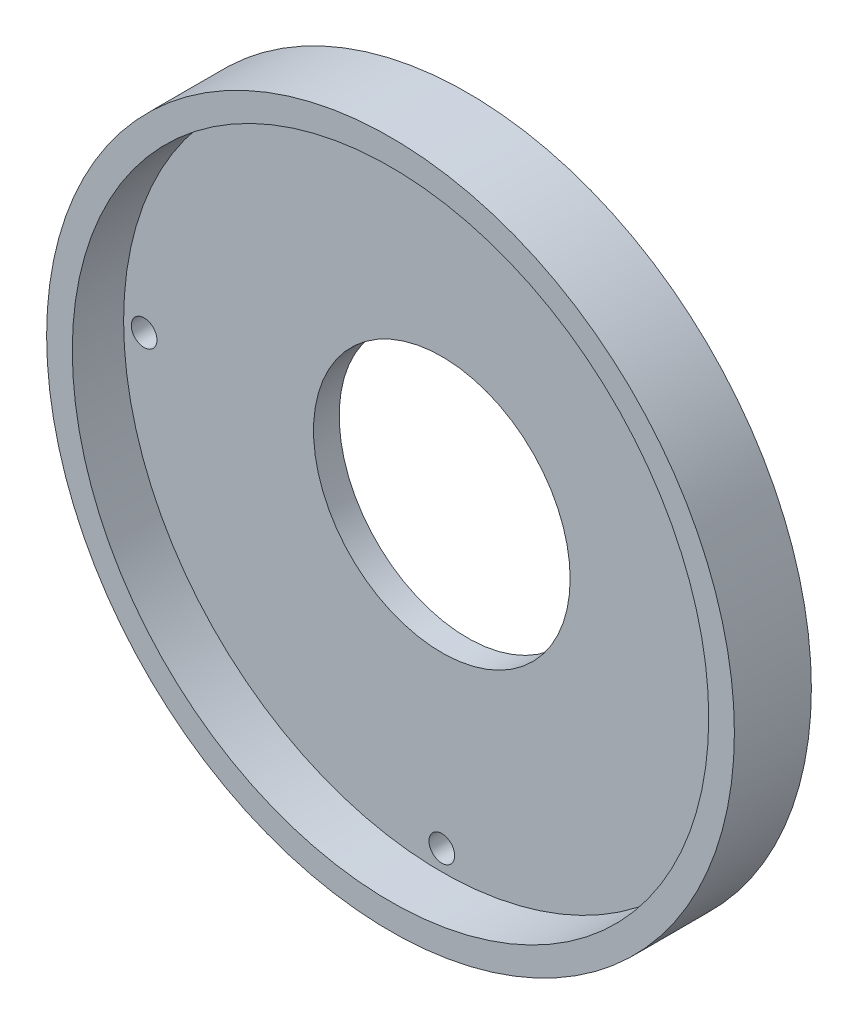
ISO-10303-21;
HEADER;
FILE_DESCRIPTION(('STEP AP214'),'2;1');
FILE_NAME('part.step','',(''),(''),'','','');
FILE_SCHEMA(('AUTOMOTIVE_DESIGN { 1 0 10303 214 1 1 1 1 }'));
ENDSEC;
DATA;
#1=APPLICATION_CONTEXT('core data for automotive mechanical design processes');
#2=APPLICATION_PROTOCOL_DEFINITION('international standard','automotive_design',2000,#1);
#3=PRODUCT_CONTEXT('',#1,'mechanical');
#4=PRODUCT('Part','Part','',(#3));
#5=PRODUCT_RELATED_PRODUCT_CATEGORY('part','',(#4));
#6=PRODUCT_DEFINITION_FORMATION('','',#4);
#7=PRODUCT_DEFINITION_CONTEXT('part definition',#1,'design');
#8=PRODUCT_DEFINITION('design','',#6,#7);
#9=PRODUCT_DEFINITION_SHAPE('','',#8);
#10=(LENGTH_UNIT() NAMED_UNIT(*) SI_UNIT(.MILLI.,.METRE.));
#11=(NAMED_UNIT(*) PLANE_ANGLE_UNIT() SI_UNIT($,.RADIAN.));
#12=(NAMED_UNIT(*) SI_UNIT($,.STERADIAN.) SOLID_ANGLE_UNIT());
#13=UNCERTAINTY_MEASURE_WITH_UNIT(LENGTH_MEASURE(1.E-05),#10,'distance_accuracy_value','');
#14=(GEOMETRIC_REPRESENTATION_CONTEXT(3) GLOBAL_UNCERTAINTY_ASSIGNED_CONTEXT((#13)) GLOBAL_UNIT_ASSIGNED_CONTEXT((#10,
#11,#12)) REPRESENTATION_CONTEXT('',''));
#15=CARTESIAN_POINT('',(0.,0.,0.));
#16=DIRECTION('',(0.,0.,1.));
#17=DIRECTION('',(1.,0.,0.));
#18=AXIS2_PLACEMENT_3D('',#15,#16,#17);
#19=CARTESIAN_POINT('',(0.,0.,5.));
#20=DIRECTION('',(0.,0.,-1.));
#21=DIRECTION('',(-1.,0.,0.));
#22=AXIS2_PLACEMENT_3D('',#19,#20,#21);
#23=CYLINDRICAL_SURFACE('',#22,67.);
#24=CARTESIAN_POINT('',(0.,0.,0.));
#25=DIRECTION('',(0.,0.,1.));
#26=DIRECTION('',(1.,0.,0.));
#27=AXIS2_PLACEMENT_3D('',#24,#25,#26);
#28=CIRCLE('',#27,67.);
#29=CARTESIAN_POINT('',(67.,0.,0.));
#30=VERTEX_POINT('',#29);
#31=EDGE_CURVE('E48',#30,#30,#28,.T.);
#32=ORIENTED_EDGE('',*,*,#31,.T.);
#33=EDGE_LOOP('',(#32));
#34=FACE_BOUND('',#33,.T.);
#35=CARTESIAN_POINT('',(0.,0.,15.));
#36=DIRECTION('',(0.,0.,1.));
#37=DIRECTION('',(1.,0.,0.));
#38=AXIS2_PLACEMENT_3D('',#35,#36,#37);
#39=CIRCLE('',#38,67.);
#40=CARTESIAN_POINT('',(67.,0.,15.));
#41=VERTEX_POINT('',#40);
#42=EDGE_CURVE('E89',#41,#41,#39,.T.);
#43=ORIENTED_EDGE('',*,*,#42,.F.);
#44=EDGE_LOOP('',(#43));
#45=FACE_BOUND('',#44,.T.);
#46=CARTESIAN_POINT('',(48.2517919166919,-46.4840249637256,10.));
#47=CARTESIAN_POINT('',(48.251789828071,-46.4840272751934,10.0702064929586));
#48=CARTESIAN_POINT('',(48.2476744077071,-46.488300234178,10.1404637367399));
#49=CARTESIAN_POINT('',(48.2313079825116,-46.5052799581222,10.2790428534805));
#50=CARTESIAN_POINT('',(48.2190472140223,-46.5179968446309,10.3473623010423));
#51=CARTESIAN_POINT('',(48.1867201860451,-46.551482642508,10.4800381366662));
#52=CARTESIAN_POINT('',(48.1666576896979,-46.5722476718622,10.5443964180764));
#53=CARTESIAN_POINT('',(48.1192723617108,-46.6212052856211,10.6673348688312));
#54=CARTESIAN_POINT('',(48.0919513226366,-46.6493960361591,10.7259164598931));
#55=CARTESIAN_POINT('',(48.0307787559355,-46.712377523685,10.8356723307161));
#56=CARTESIAN_POINT('',(47.996925836134,-46.7471696676369,10.8868450273029));
#57=CARTESIAN_POINT('',(47.9236127295296,-46.8223247270508,10.9803174329759));
#58=CARTESIAN_POINT('',(47.8841523214327,-46.8626878623647,11.0226167917214));
#59=CARTESIAN_POINT('',(47.8007045773974,-46.9478028103199,11.0971415966695));
#60=CARTESIAN_POINT('',(47.7567169959419,-46.9925548609739,11.1293664961326));
#61=CARTESIAN_POINT('',(47.6654330583694,-47.0851432348739,11.1828239081577));
#62=CARTESIAN_POINT('',(47.6181367114616,-47.1329795495353,11.2040564513135));
#63=CARTESIAN_POINT('',(47.5215608296741,-47.2303499369865,11.2349241394158));
#64=CARTESIAN_POINT('',(47.4722815256982,-47.2798838120061,11.2445606306394));
#65=CARTESIAN_POINT('',(47.3731231330027,-47.3792373286811,11.2519668027085));
#66=CARTESIAN_POINT('',(47.3232440458719,-47.4290569695793,11.2497365149799));
#67=CARTESIAN_POINT('',(47.2243109615949,-47.5275638744133,11.2334736192552));
#68=CARTESIAN_POINT('',(47.1752568627573,-47.5762512782005,11.2194424769183));
#69=CARTESIAN_POINT('',(47.0793750905388,-47.6711337533546,11.1799784246335));
#70=CARTESIAN_POINT('',(47.0325474204947,-47.7173288209859,11.1545454975975));
#71=CARTESIAN_POINT('',(46.9424711382421,-47.805945237673,11.0929981512557));
#72=CARTESIAN_POINT('',(46.8992227514692,-47.8483663490445,11.0568830598044));
#73=CARTESIAN_POINT('',(46.8175701533502,-47.9282629904647,10.9749970870454));
#74=CARTESIAN_POINT('',(46.7791659450846,-47.9657385173686,10.9292261995976));
#75=CARTESIAN_POINT('',(46.708324886773,-48.0347253250798,10.8293195985362));
#76=CARTESIAN_POINT('',(46.6758889476767,-48.0662356954335,10.775182610303));
#77=CARTESIAN_POINT('',(46.6179512966809,-48.1224298138941,10.6600850799366));
#78=CARTESIAN_POINT('',(46.592449585765,-48.1471135610323,10.5991245368353));
#79=CARTESIAN_POINT('',(46.5491389199342,-48.1889881383567,10.4721096708294));
#80=CARTESIAN_POINT('',(46.5313299930771,-48.206178941214,10.4060553293474));
#81=CARTESIAN_POINT('',(46.5039371004404,-48.2326051492383,10.270728259245));
#82=CARTESIAN_POINT('',(46.494353125771,-48.2418405630039,10.2014555341033));
#83=CARTESIAN_POINT('',(46.4836980368134,-48.2521074441508,10.0616693208256));
#84=CARTESIAN_POINT('',(46.4826256390243,-48.2531401484574,9.99115602136895));
#85=CARTESIAN_POINT('',(46.4890224769164,-48.2469771914363,9.85088047712377));
#86=CARTESIAN_POINT('',(46.4964917090087,-48.2397815335658,9.7811182320197));
#87=CARTESIAN_POINT('',(46.5197471772284,-48.2173555971766,9.64433008579414));
#88=CARTESIAN_POINT('',(46.5355328324232,-48.2021258798663,9.5773039938947));
#89=CARTESIAN_POINT('',(46.5749490062566,-48.1640412732132,9.44788496451764));
#90=CARTESIAN_POINT('',(46.5985795303834,-48.1411863785358,9.38549203028148));
#91=CARTESIAN_POINT('',(46.6529852425397,-48.088464287982,9.26710223822672));
#92=CARTESIAN_POINT('',(46.6837612874791,-48.0585962510659,9.21110614873742));
#93=CARTESIAN_POINT('',(46.7515448445478,-47.9926586497345,9.10710729537145));
#94=CARTESIAN_POINT('',(46.7885523643688,-47.9565890776644,9.05910454136134));
#95=CARTESIAN_POINT('',(46.8677142502859,-47.879227420153,8.97244907799339));
#96=CARTESIAN_POINT('',(46.9098692486557,-47.8379346931203,8.93379751900074));
#97=CARTESIAN_POINT('',(46.9980897265132,-47.7512657487691,8.86694952481393));
#98=CARTESIAN_POINT('',(47.0441552000575,-47.7058895376572,8.83875307372934));
#99=CARTESIAN_POINT('',(47.1388568235701,-47.6123156812711,8.79361768910238));
#100=CARTESIAN_POINT('',(47.1874928020894,-47.564118224147,8.77667800576998));
#101=CARTESIAN_POINT('',(47.2859389673229,-47.4662489734514,8.7545345460248));
#102=CARTESIAN_POINT('',(47.3357491549374,-47.4165771787493,8.74933077861037));
#103=CARTESIAN_POINT('',(47.4351157109638,-47.3171716786096,8.75080698497163));
#104=CARTESIAN_POINT('',(47.4846721171809,-47.2674379838513,8.75748513383861));
#105=CARTESIAN_POINT('',(47.5821396096096,-47.1693202626239,8.78253187720165));
#106=CARTESIAN_POINT('',(47.6300506925292,-47.1209362388552,8.8009004950861));
#107=CARTESIAN_POINT('',(47.7228884059709,-47.0269102860541,8.84880676898909));
#108=CARTESIAN_POINT('',(47.767814982261,-46.9812684068509,8.87834462790012));
#109=CARTESIAN_POINT('',(47.8534365340607,-46.8940545404213,8.94774950571533));
#110=CARTESIAN_POINT('',(47.8941316705603,-46.8524823983606,8.98761613144788));
#111=CARTESIAN_POINT('',(47.9701767198103,-46.7746203915713,9.07654928090811));
#112=CARTESIAN_POINT('',(48.0055263802645,-46.7383307761706,9.12561623862894));
#113=CARTESIAN_POINT('',(48.0699232069843,-46.6720968355887,9.2315724712398));
#114=CARTESIAN_POINT('',(48.0989688068869,-46.6421540874497,9.28846368449064));
#115=CARTESIAN_POINT('',(48.1499728020355,-46.5894995456785,9.40846815173468));
#116=CARTESIAN_POINT('',(48.1719273383991,-46.5667916892893,9.47158476922309));
#117=CARTESIAN_POINT('',(48.2081158770327,-46.5293267572731,9.60217601971434));
#118=CARTESIAN_POINT('',(48.2223591159574,-46.514560169672,9.66964533007674));
#119=CARTESIAN_POINT('',(48.2389556002918,-46.4973466009984,9.78128597416283));
#120=CARTESIAN_POINT('',(48.2437634717728,-46.4923575207855,9.82473218694259));
#121=CARTESIAN_POINT('',(48.2501822835991,-46.4856959787714,9.91211230247487));
#122=CARTESIAN_POINT('',(48.2517932243034,-46.4840235165975,9.95604620517261));
#123=CARTESIAN_POINT('',(48.2517919166919,-46.4840249637256,10.));
#124=B_SPLINE_CURVE_WITH_KNOTS('',3,(#46,#47,#48,#49,#50,#51,#52,#53,#54,#55,#56,#57,#58,#59,
#60,#61,#62,#63,#64,#65,#66,#67,#68,#69,#70,#71,#72,#73,#74,#75,#76,#77,#78,#79,#80,#81,#82,#83,
#84,#85,#86,#87,#88,#89,#90,#91,#92,#93,#94,#95,#96,#97,#98,#99,#100,#101,#102,#103,#104,#105,
#106,#107,#108,#109,#110,#111,#112,#113,#114,#115,#116,#117,#118,#119,#120,#121,#122,#123),
.UNSPECIFIED.,.T.,.F.,(4,2,2,2,2,2,2,2,2,2,2,2,2,2,2,2,2,2,2,2,2,2,2,2,2,2,2,2,2,2,2,2,2,2,2,2,
2,2,4),(0.,0.210459045387895,0.421170819891678,0.631781084002256,0.842339384187117,
1.0529426114585,1.26355415228515,1.4741771209869,1.68479950348121,1.89539743080288,
2.10599480041363,2.31656601781328,2.52713755079725,2.73772233622744,2.94830725556891,
3.15892429032242,3.3695413549579,3.58015918777034,3.79077679293918,4.00136263748101,
4.21194839354172,4.42251944136815,4.63309063651287,4.84368709697152,5.05428381737761,
5.26490643181046,5.47552872612255,5.68613698991236,5.89674541518302,6.10732149651478,
6.3178979991344,6.52847832712061,6.73905064039871,6.9496328891816,7.16026740135609,
7.37101634624582,7.58151229267663,7.71327325024628,7.84503419301265),.UNSPECIFIED.);
#125=CARTESIAN_POINT('',(48.2517919166919,-46.4840249637256,10.));
#126=VERTEX_POINT('',#125);
#127=EDGE_CURVE('E75',#126,#126,#124,.T.);
#128=ORIENTED_EDGE('',*,*,#127,.F.);
#129=EDGE_LOOP('',(#128));
#130=FACE_BOUND('',#129,.T.);
#131=CARTESIAN_POINT('',(-46.4840249637256,48.251791916692,10.));
#132=CARTESIAN_POINT('',(-46.4840272751934,48.251789828071,9.92979350704138));
#133=CARTESIAN_POINT('',(-46.4883002341779,48.2476744077071,9.8595362632601));
#134=CARTESIAN_POINT('',(-46.5052799581222,48.2313079825116,9.72095714651947));
#135=CARTESIAN_POINT('',(-46.5179968446309,48.2190472140223,9.65263769895769));
#136=CARTESIAN_POINT('',(-46.551482642508,48.1867201860451,9.51996186333377));
#137=CARTESIAN_POINT('',(-46.5722476718622,48.1666576896979,9.45560358192357));
#138=CARTESIAN_POINT('',(-46.6212052856211,48.1192723617108,9.33266513116878));
#139=CARTESIAN_POINT('',(-46.6493960361591,48.0919513226366,9.27408354010694));
#140=CARTESIAN_POINT('',(-46.712377523685,48.0307787559355,9.16432766928394));
#141=CARTESIAN_POINT('',(-46.7471696676369,47.996925836134,9.11315497269706));
#142=CARTESIAN_POINT('',(-46.8223247270508,47.9236127295296,9.01968256702407));
#143=CARTESIAN_POINT('',(-46.8626878623647,47.8841523214327,8.97738320827859));
#144=CARTESIAN_POINT('',(-46.9478028103199,47.8007045773974,8.90285840333053));
#145=CARTESIAN_POINT('',(-46.9925548609739,47.7567169959419,8.87063350386744));
#146=CARTESIAN_POINT('',(-47.0851432348739,47.6654330583694,8.81717609184233));
#147=CARTESIAN_POINT('',(-47.1329795495353,47.6181367114616,8.79594354868647));
#148=CARTESIAN_POINT('',(-47.2303499369865,47.5215608296741,8.76507586058415));
#149=CARTESIAN_POINT('',(-47.2798838120061,47.4722815256982,8.75543936936062));
#150=CARTESIAN_POINT('',(-47.3792373286811,47.3731231330027,8.74803319729154));
#151=CARTESIAN_POINT('',(-47.4290569695794,47.3232440458719,8.75026348502008));
#152=CARTESIAN_POINT('',(-47.5275638744133,47.2243109615949,8.76652638074484));
#153=CARTESIAN_POINT('',(-47.5762512782005,47.1752568627573,8.78055752308166));
#154=CARTESIAN_POINT('',(-47.6711337533546,47.0793750905388,8.82002157536654));
#155=CARTESIAN_POINT('',(-47.7173288209859,47.0325474204947,8.84545450240246));
#156=CARTESIAN_POINT('',(-47.805945237673,46.9424711382422,8.90700184874428));
#157=CARTESIAN_POINT('',(-47.8483663490445,46.8992227514692,8.9431169401956));
#158=CARTESIAN_POINT('',(-47.9282629904647,46.8175701533502,9.02500291295462));
#159=CARTESIAN_POINT('',(-47.9657385173686,46.7791659450845,9.07077380040244));
#160=CARTESIAN_POINT('',(-48.0347253250798,46.708324886773,9.17068040146384));
#161=CARTESIAN_POINT('',(-48.0662356954335,46.6758889476767,9.224817389697));
#162=CARTESIAN_POINT('',(-48.1224298138941,46.6179512966809,9.3399149200634));
#163=CARTESIAN_POINT('',(-48.1471135610323,46.592449585765,9.40087546316474));
#164=CARTESIAN_POINT('',(-48.1889881383567,46.5491389199342,9.52789032917056));
#165=CARTESIAN_POINT('',(-48.206178941214,46.5313299930771,9.5939446706526));
#166=CARTESIAN_POINT('',(-48.2326051492383,46.5039371004404,9.72927174075497));
#167=CARTESIAN_POINT('',(-48.2418405630039,46.494353125771,9.79854446589668));
#168=CARTESIAN_POINT('',(-48.2521074441508,46.4836980368134,9.93833067917437));
#169=CARTESIAN_POINT('',(-48.2531401484574,46.4826256390243,10.008843978631));
#170=CARTESIAN_POINT('',(-48.2469771914363,46.4890224769164,10.1491195228762));
#171=CARTESIAN_POINT('',(-48.2397815335658,46.4964917090087,10.2188817679803));
#172=CARTESIAN_POINT('',(-48.2173555971766,46.5197471772284,10.3556699142058));
#173=CARTESIAN_POINT('',(-48.2021258798663,46.5355328324233,10.4226960061053));
#174=CARTESIAN_POINT('',(-48.1640412732132,46.5749490062566,10.5521150354824));
#175=CARTESIAN_POINT('',(-48.1411863785358,46.5985795303834,10.6145079697185));
#176=CARTESIAN_POINT('',(-48.088464287982,46.6529852425397,10.7328977617733));
#177=CARTESIAN_POINT('',(-48.0585962510659,46.6837612874791,10.7888938512626));
#178=CARTESIAN_POINT('',(-47.9926586497345,46.7515448445478,10.8928927046285));
#179=CARTESIAN_POINT('',(-47.9565890776644,46.7885523643688,10.9408954586386));
#180=CARTESIAN_POINT('',(-47.879227420153,46.8677142502859,11.0275509220066));
#181=CARTESIAN_POINT('',(-47.8379346931203,46.9098692486557,11.0662024809993));
#182=CARTESIAN_POINT('',(-47.7512657487691,46.9980897265132,11.1330504751861));
#183=CARTESIAN_POINT('',(-47.7058895376572,47.0441552000575,11.1612469262707));
#184=CARTESIAN_POINT('',(-47.6123156812711,47.1388568235701,11.2063823108976));
#185=CARTESIAN_POINT('',(-47.564118224147,47.1874928020894,11.22332199423));
#186=CARTESIAN_POINT('',(-47.4662489734514,47.2859389673229,11.2454654539752));
#187=CARTESIAN_POINT('',(-47.4165771787493,47.3357491549374,11.2506692213896));
#188=CARTESIAN_POINT('',(-47.3171716786096,47.4351157109638,11.2491930150284));
#189=CARTESIAN_POINT('',(-47.2674379838513,47.4846721171809,11.2425148661614));
#190=CARTESIAN_POINT('',(-47.1693202626239,47.5821396096096,11.2174681227984));
#191=CARTESIAN_POINT('',(-47.1209362388552,47.6300506925292,11.1990995049139));
#192=CARTESIAN_POINT('',(-47.0269102860541,47.7228884059709,11.1511932310109));
#193=CARTESIAN_POINT('',(-46.9812684068509,47.767814982261,11.1216553720999));
#194=CARTESIAN_POINT('',(-46.8940545404213,47.8534365340607,11.0522504942847));
#195=CARTESIAN_POINT('',(-46.8524823983606,47.8941316705603,11.0123838685521));
#196=CARTESIAN_POINT('',(-46.7746203915713,47.9701767198103,10.9234507190919));
#197=CARTESIAN_POINT('',(-46.7383307761706,48.0055263802645,10.8743837613711));
#198=CARTESIAN_POINT('',(-46.6720968355887,48.0699232069843,10.7684275287602));
#199=CARTESIAN_POINT('',(-46.6421540874497,48.0989688068869,10.7115363155094));
#200=CARTESIAN_POINT('',(-46.5894995456785,48.1499728020355,10.5915318482653));
#201=CARTESIAN_POINT('',(-46.5667916892893,48.1719273383991,10.5284152307769));
#202=CARTESIAN_POINT('',(-46.5293267572731,48.2081158770327,10.3978239802857));
#203=CARTESIAN_POINT('',(-46.514560169672,48.2223591159574,10.3303546699233));
#204=CARTESIAN_POINT('',(-46.4973466009984,48.2389556002918,10.2187140258372));
#205=CARTESIAN_POINT('',(-46.4923575207855,48.2437634717729,10.1752678130574));
#206=CARTESIAN_POINT('',(-46.4856959787714,48.2501822835991,10.0878876975251));
#207=CARTESIAN_POINT('',(-46.4840235165975,48.2517932243034,10.0439537948274));
#208=CARTESIAN_POINT('',(-46.4840249637256,48.251791916692,10.));
#209=B_SPLINE_CURVE_WITH_KNOTS('',3,(#131,#132,#133,#134,#135,#136,#137,#138,#139,#140,#141,
#142,#143,#144,#145,#146,#147,#148,#149,#150,#151,#152,#153,#154,#155,#156,#157,#158,#159,#160,
#161,#162,#163,#164,#165,#166,#167,#168,#169,#170,#171,#172,#173,#174,#175,#176,#177,#178,#179,
#180,#181,#182,#183,#184,#185,#186,#187,#188,#189,#190,#191,#192,#193,#194,#195,#196,#197,#198,
#199,#200,#201,#202,#203,#204,#205,#206,#207,#208),.UNSPECIFIED.,.T.,.F.,(4,2,2,2,2,2,2,2,2,2,2,
2,2,2,2,2,2,2,2,2,2,2,2,2,2,2,2,2,2,2,2,2,2,2,2,2,2,2,4),(0.,0.210459045387895,
0.421170819891678,0.631781084002256,0.842339384187119,1.0529426114585,1.26355415228514,
1.4741771209869,1.68479950348121,1.89539743080289,2.10599480041365,2.31656601781329,
2.52713755079725,2.73772233622746,2.94830725556892,3.15892429032243,3.36954135495791,
3.58015918777034,3.79077679293918,4.001362637481,4.21194839354172,4.42251944136815,
4.63309063651287,4.84368709697151,5.0542838173776,5.26490643181046,5.47552872612255,
5.68613698991234,5.89674541518301,6.10732149651477,6.31789799913439,6.52847832712059,
6.73905064039871,6.94963288918159,7.16026740135609,7.37101634624581,7.5815122926766,
7.71327325024627,7.84503419301266),.UNSPECIFIED.);
#210=CARTESIAN_POINT('',(-46.4840249637256,48.251791916692,10.));
#211=VERTEX_POINT('',#210);
#212=EDGE_CURVE('E80',#211,#211,#209,.T.);
#213=ORIENTED_EDGE('',*,*,#212,.F.);
#214=EDGE_LOOP('',(#213));
#215=FACE_BOUND('',#214,.T.);
#216=ADVANCED_FACE('F35',(#34,#45,#130,#215),#23,.T.);
#217=CARTESIAN_POINT('',(0.,0.,15.));
#218=DIRECTION('',(0.,0.,-1.));
#219=DIRECTION('',(-1.,0.,0.));
#220=AXIS2_PLACEMENT_3D('',#217,#218,#219);
#221=CYLINDRICAL_SURFACE('',#220,62.);
#222=CARTESIAN_POINT('',(44.715592888734,-42.9478259357677,10.));
#223=CARTESIAN_POINT('',(44.7155908093487,-42.947828255938,10.0702053928779));
#224=CARTESIAN_POINT('',(44.7114818721264,-42.9521074362192,10.1404615096897));
#225=CARTESIAN_POINT('',(44.695140725686,-42.969111338227,10.2790383280711));
#226=CARTESIAN_POINT('',(44.6828987724066,-42.9818461905745,10.3473566054416));
#227=CARTESIAN_POINT('',(44.6506196582907,-43.0153775134214,10.4800300947139));
#228=CARTESIAN_POINT('',(44.6305862614873,-43.0361700912301,10.5443872028875));
#229=CARTESIAN_POINT('',(44.5832662194044,-43.0851891962377,10.6673235399097));
#230=CARTESIAN_POINT('',(44.5559813627993,-43.1134138901848,10.7259041887242));
#231=CARTESIAN_POINT('',(44.4948836873988,-43.1764663612608,10.8356596014132));
#232=CARTESIAN_POINT('',(44.4610693580821,-43.2112956662597,10.8868326468185));
#233=CARTESIAN_POINT('',(44.3878319206897,-43.2865236216246,10.9803060025797));
#234=CARTESIAN_POINT('',(44.34840859106,-43.326922491985,11.0226059622878));
#235=CARTESIAN_POINT('',(44.26502876764,-43.412104015551,11.0971326962586));
#236=CARTESIAN_POINT('',(44.221071972589,-43.4568869600798,11.1293588005127));
#237=CARTESIAN_POINT('',(44.1298402687901,-43.549528355787,11.1828185301962));
#238=CARTESIAN_POINT('',(44.0825653697079,-43.5973867980066,11.2040521876447));
#239=CARTESIAN_POINT('',(43.9860215900491,-43.694789202552,11.2349215742704));
#240=CARTESIAN_POINT('',(43.9367529813389,-43.7443329349224,11.2445588792777));
#241=CARTESIAN_POINT('',(43.837603193369,-43.8436936332995,11.2519668343638));
#242=CARTESIAN_POINT('',(43.7877220158191,-43.8935105985434,11.2497375175526));
#243=CARTESIAN_POINT('',(43.6887733265145,-43.9919988021672,11.2334768811907));
#244=CARTESIAN_POINT('',(43.6397056977637,-44.0406702057198,11.2194472739147));
#245=CARTESIAN_POINT('',(43.5437859657533,-44.1355101456543,11.1799869478343));
#246=CARTESIAN_POINT('',(43.4969338659786,-44.1816786780995,11.1545562110975));
#247=CARTESIAN_POINT('',(43.4068000907053,-44.270234949513,11.0930135549585));
#248=CARTESIAN_POINT('',(43.3635186780129,-44.3126224102094,11.0569008502482));
#249=CARTESIAN_POINT('',(43.2817955673761,-44.3924480160088,10.9750199744317));
#250=CARTESIAN_POINT('',(43.2433538733545,-44.4298861571002,10.9292517954998));
#251=CARTESIAN_POINT('',(43.1724365653128,-44.4987996695922,10.8293494624819));
#252=CARTESIAN_POINT('',(43.1399620149048,-44.5302739780019,10.7752138200996));
#253=CARTESIAN_POINT('',(43.0819513009418,-44.5864004671303,10.6601185463538));
#254=CARTESIAN_POINT('',(43.0564151383858,-44.6110526468666,10.5991589140077));
#255=CARTESIAN_POINT('',(43.0130435088841,-44.6528722509663,10.4721452850912));
#256=CARTESIAN_POINT('',(42.9952080749919,-44.6700396432032,10.4060912666557));
#257=CARTESIAN_POINT('',(42.9677730677467,-44.6964298689141,10.2707643012108));
#258=CARTESIAN_POINT('',(42.9581734840594,-44.705652712357,10.2014913582406));
#259=CARTESIAN_POINT('',(42.947499901984,-44.7159066572379,10.0617060495823));
#260=CARTESIAN_POINT('',(42.9464244025498,-44.7169392009444,9.99119390430316));
#261=CARTESIAN_POINT('',(42.9528274208298,-44.7107888043626,9.85092032437531));
#262=CARTESIAN_POINT('',(42.9603059342818,-44.7036058681678,9.78115888935258));
#263=CARTESIAN_POINT('',(42.9835909771213,-44.6812171370972,9.64437282751829));
#264=CARTESIAN_POINT('',(42.99939682694,-44.6660119968892,9.57734797786306));
#265=CARTESIAN_POINT('',(43.0388618417979,-44.627985815157,9.44793087464638));
#266=CARTESIAN_POINT('',(43.062521013424,-44.605164767245,9.38553862497045));
#267=CARTESIAN_POINT('',(43.1169895849355,-44.5525155134001,9.26714824444169));
#268=CARTESIAN_POINT('',(43.1477999863148,-44.5226863260051,9.21115101081917));
#269=CARTESIAN_POINT('',(43.2156535419285,-44.4568275784832,9.10714923776247));
#270=CARTESIAN_POINT('',(43.2526967047247,-44.4207980098391,9.05914470930773));
#271=CARTESIAN_POINT('',(43.3319278847921,-44.3435122994898,8.97248411595851));
#272=CARTESIAN_POINT('',(43.3741166398532,-44.3022554082432,8.93382939404198));
#273=CARTESIAN_POINT('',(43.4623981889017,-44.2156506469564,8.8669748957454));
#274=CARTESIAN_POINT('',(43.5084909766519,-44.1703027834521,8.83877510266254));
#275=CARTESIAN_POINT('',(43.6032371441285,-44.0767754900627,8.79363329079431));
#276=CARTESIAN_POINT('',(43.6518903246135,-44.0285962804697,8.77669039742802));
#277=CARTESIAN_POINT('',(43.7503592561751,-43.9307509670954,8.75454045685662));
#278=CARTESIAN_POINT('',(43.8001750079409,-43.8810848624324,8.74933341661079));
#279=CARTESIAN_POINT('',(43.8995390724707,-43.781678898552,8.75080311969725));
#280=CARTESIAN_POINT('',(43.9490874315161,-43.7319390541302,8.75747773571826));
#281=CARTESIAN_POINT('',(44.046527313812,-43.6337967099096,8.78251693207905));
#282=CARTESIAN_POINT('',(44.0944188337508,-43.585394212784,8.8008815357834));
#283=CARTESIAN_POINT('',(44.1872080985022,-43.4913210800808,8.84877934599639));
#284=CARTESIAN_POINT('',(44.2321057892501,-43.4456504938396,8.8783127541346));
#285=CARTESIAN_POINT('',(44.3176636177573,-43.3583720970987,8.94770839888812));
#286=CARTESIAN_POINT('',(44.3583239158812,-43.3167641328527,8.98757024442354));
#287=CARTESIAN_POINT('',(44.4342984037792,-43.2388262215491,9.07649484105321));
#288=CARTESIAN_POINT('',(44.4696122049883,-43.2024966581155,9.12555826030686));
#289=CARTESIAN_POINT('',(44.5339394614718,-43.1361840751427,9.23150794474228));
#290=CARTESIAN_POINT('',(44.5629513513018,-43.1062026325731,9.28839614794321));
#291=CARTESIAN_POINT('',(44.6138943855758,-43.0534757815586,9.40839601089572));
#292=CARTESIAN_POINT('',(44.6358215958561,-43.0307343936602,9.47151110317046));
#293=CARTESIAN_POINT('',(44.6719648546709,-42.9932115710068,9.60210028959681));
#294=CARTESIAN_POINT('',(44.6861901254788,-42.9784206165864,9.66956906179267));
#295=CARTESIAN_POINT('',(44.7027685661813,-42.9611750416965,9.78122176112231));
#296=CARTESIAN_POINT('',(44.7075719652858,-42.9561756998483,9.82468053928662));
#297=CARTESIAN_POINT('',(44.7139847774701,-42.9495004205874,9.91208624700936));
#298=CARTESIAN_POINT('',(44.7155941909697,-42.9478244827379,9.95603317650363));
#299=CARTESIAN_POINT('',(44.715592888734,-42.9478259357677,10.));
#300=B_SPLINE_CURVE_WITH_KNOTS('',3,(#222,#223,#224,#225,#226,#227,#228,#229,#230,#231,#232,
#233,#234,#235,#236,#237,#238,#239,#240,#241,#242,#243,#244,#245,#246,#247,#248,#249,#250,#251,
#252,#253,#254,#255,#256,#257,#258,#259,#260,#261,#262,#263,#264,#265,#266,#267,#268,#269,#270,
#271,#272,#273,#274,#275,#276,#277,#278,#279,#280,#281,#282,#283,#284,#285,#286,#287,#288,#289,
#290,#291,#292,#293,#294,#295,#296,#297,#298,#299),.UNSPECIFIED.,.T.,.F.,(4,2,2,2,2,2,2,2,2,2,2,
2,2,2,2,2,2,2,2,2,2,2,2,2,2,2,2,2,2,2,2,2,2,2,2,2,2,2,4),(0.,0.210455697208501,
0.421163994473695,0.631770625109284,0.842325354798001,1.05292885247608,1.26354067124544,
1.47416649475455,1.68479170474334,1.89538828960695,2.10598428686897,2.31654973098247,
2.52711550628336,2.73769676563003,2.94827819565062,3.15889712437339,3.36951608342441,
3.58013594649658,3.79075554528357,4.00133805424932,4.21192045828722,4.42248567998896,
4.63305107829807,4.84364598304706,5.05424117708393,5.26486660243867,5.47549169129625,
5.68610041417052,5.89670926193417,6.1072804057355,6.31785197040286,6.52842733668413,
6.7389947308243,6.94957742094516,7.1602123617916,7.37096406921158,7.58146286207232,
7.71326284679808,7.84506281420314),.UNSPECIFIED.);
#301=CARTESIAN_POINT('',(44.715592888734,-42.9478259357677,10.));
#302=VERTEX_POINT('',#301);
#303=EDGE_CURVE('E57',#302,#302,#300,.T.);
#304=ORIENTED_EDGE('',*,*,#303,.T.);
#305=EDGE_LOOP('',(#304));
#306=FACE_BOUND('',#305,.T.);
#307=CARTESIAN_POINT('',(0.,0.,15.));
#308=DIRECTION('',(0.,0.,1.));
#309=DIRECTION('',(1.,0.,0.));
#310=AXIS2_PLACEMENT_3D('',#307,#308,#309);
#311=CIRCLE('',#310,62.);
#312=CARTESIAN_POINT('',(62.,0.,15.));
#313=VERTEX_POINT('',#312);
#314=EDGE_CURVE('E86',#313,#313,#311,.T.);
#315=ORIENTED_EDGE('',*,*,#314,.T.);
#316=EDGE_LOOP('',(#315));
#317=FACE_BOUND('',#316,.T.);
#318=CARTESIAN_POINT('',(0.,0.,5.));
#319=DIRECTION('',(0.,0.,1.));
#320=DIRECTION('',(1.,0.,0.));
#321=AXIS2_PLACEMENT_3D('',#318,#319,#320);
#322=CIRCLE('',#321,62.);
#323=CARTESIAN_POINT('',(62.,0.,5.));
#324=VERTEX_POINT('',#323);
#325=EDGE_CURVE('E10',#324,#324,#322,.F.);
#326=ORIENTED_EDGE('',*,*,#325,.T.);
#327=EDGE_LOOP('',(#326));
#328=FACE_BOUND('',#327,.T.);
#329=CARTESIAN_POINT('',(-42.9478259357677,44.7155928887341,10.));
#330=CARTESIAN_POINT('',(-42.9478282559381,44.7155908093487,9.92979460712207));
#331=CARTESIAN_POINT('',(-42.9521074362192,44.7114818721264,9.8595384903103));
#332=CARTESIAN_POINT('',(-42.969111338227,44.695140725686,9.72096167192888));
#333=CARTESIAN_POINT('',(-42.9818461905745,44.6828987724066,9.65264339455841));
#334=CARTESIAN_POINT('',(-43.0153775134214,44.6506196582907,9.51996990528614));
#335=CARTESIAN_POINT('',(-43.0361700912301,44.6305862614873,9.45561279711247));
#336=CARTESIAN_POINT('',(-43.0851891962377,44.5832662194044,9.33267646009033));
#337=CARTESIAN_POINT('',(-43.1134138901849,44.5559813627993,9.27409581127582));
#338=CARTESIAN_POINT('',(-43.1764663612608,44.4948836873988,9.16434039858681));
#339=CARTESIAN_POINT('',(-43.2112956662597,44.4610693580821,9.11316735318152));
#340=CARTESIAN_POINT('',(-43.2865236216246,44.3878319206897,9.01969399742026));
#341=CARTESIAN_POINT('',(-43.326922491985,44.3484085910601,8.97739403771214));
#342=CARTESIAN_POINT('',(-43.412104015551,44.2650287676401,8.90286730374135));
#343=CARTESIAN_POINT('',(-43.4568869600798,44.221071972589,8.87064119948729));
#344=CARTESIAN_POINT('',(-43.549528355787,44.1298402687901,8.81718146980383));
#345=CARTESIAN_POINT('',(-43.5973867980066,44.0825653697079,8.79594781235532));
#346=CARTESIAN_POINT('',(-43.694789202552,43.9860215900491,8.76507842572959));
#347=CARTESIAN_POINT('',(-43.7443329349224,43.9367529813389,8.75544112072229));
#348=CARTESIAN_POINT('',(-43.8436936332995,43.8376031933691,8.74803316563616));
#349=CARTESIAN_POINT('',(-43.8935105985434,43.7877220158191,8.75026248244735));
#350=CARTESIAN_POINT('',(-43.9919988021672,43.6887733265145,8.76652311880932));
#351=CARTESIAN_POINT('',(-44.0406702057198,43.6397056977637,8.78055272608526));
#352=CARTESIAN_POINT('',(-44.1355101456543,43.5437859657533,8.82001305216573));
#353=CARTESIAN_POINT('',(-44.1816786780995,43.4969338659786,8.84544378890244));
#354=CARTESIAN_POINT('',(-44.270234949513,43.4068000907054,8.9069864450415));
#355=CARTESIAN_POINT('',(-44.3126224102094,43.3635186780129,8.94309914975176));
#356=CARTESIAN_POINT('',(-44.3924480160088,43.2817955673762,9.02498002556831));
#357=CARTESIAN_POINT('',(-44.4298861571002,43.2433538733545,9.07074820450023));
#358=CARTESIAN_POINT('',(-44.4987996695922,43.1724365653128,9.17065053751806));
#359=CARTESIAN_POINT('',(-44.5302739780019,43.1399620149048,9.22478617990042));
#360=CARTESIAN_POINT('',(-44.5864004671303,43.0819513009418,9.33988145364622));
#361=CARTESIAN_POINT('',(-44.6110526468666,43.0564151383858,9.40084108599228));
#362=CARTESIAN_POINT('',(-44.6528722509663,43.0130435088841,9.52785471490881));
#363=CARTESIAN_POINT('',(-44.6700396432031,42.9952080749919,9.59390873334425));
#364=CARTESIAN_POINT('',(-44.6964298689141,42.9677730677467,9.72923569878915));
#365=CARTESIAN_POINT('',(-44.705652712357,42.9581734840594,9.79850864175942));
#366=CARTESIAN_POINT('',(-44.7159066572379,42.947499901984,9.93829395041768));
#367=CARTESIAN_POINT('',(-44.7169392009444,42.9464244025498,10.0088060956968));
#368=CARTESIAN_POINT('',(-44.7107888043626,42.9528274208298,10.1490796756247));
#369=CARTESIAN_POINT('',(-44.7036058681678,42.9603059342818,10.2188411106474));
#370=CARTESIAN_POINT('',(-44.6812171370972,42.9835909771213,10.3556271724817));
#371=CARTESIAN_POINT('',(-44.6660119968892,42.99939682694,10.4226520221369));
#372=CARTESIAN_POINT('',(-44.627985815157,43.038861841798,10.5520691253536));
#373=CARTESIAN_POINT('',(-44.605164767245,43.062521013424,10.6144613750296));
#374=CARTESIAN_POINT('',(-44.5525155134001,43.1169895849355,10.7328517555583));
#375=CARTESIAN_POINT('',(-44.5226863260051,43.1477999863148,10.7888489891808));
#376=CARTESIAN_POINT('',(-44.4568275784832,43.2156535419286,10.8928507622375));
#377=CARTESIAN_POINT('',(-44.4207980098391,43.2526967047247,10.9408552906923));
#378=CARTESIAN_POINT('',(-44.3435122994898,43.3319278847922,11.0275158840415));
#379=CARTESIAN_POINT('',(-44.3022554082432,43.3741166398532,11.066170605958));
#380=CARTESIAN_POINT('',(-44.2156506469563,43.4623981889017,11.1330251042546));
#381=CARTESIAN_POINT('',(-44.170302783452,43.5084909766519,11.1612248973375));
#382=CARTESIAN_POINT('',(-44.0767754900627,43.6032371441285,11.2063667092057));
#383=CARTESIAN_POINT('',(-44.0285962804697,43.6518903246135,11.223309602572));
#384=CARTESIAN_POINT('',(-43.9307509670954,43.7503592561751,11.2454595431434));
#385=CARTESIAN_POINT('',(-43.8810848624324,43.8001750079409,11.2506665833892));
#386=CARTESIAN_POINT('',(-43.781678898552,43.8995390724708,11.2491968803027));
#387=CARTESIAN_POINT('',(-43.7319390541302,43.9490874315161,11.2425222642817));
#388=CARTESIAN_POINT('',(-43.6337967099096,44.046527313812,11.2174830679209));
#389=CARTESIAN_POINT('',(-43.585394212784,44.0944188337508,11.1991184642166));
#390=CARTESIAN_POINT('',(-43.4913210800808,44.1872080985022,11.1512206540036));
#391=CARTESIAN_POINT('',(-43.4456504938395,44.2321057892501,11.1216872458654));
#392=CARTESIAN_POINT('',(-43.3583720970987,44.3176636177573,11.0522916011119));
#393=CARTESIAN_POINT('',(-43.3167641328527,44.3583239158812,11.0124297555765));
#394=CARTESIAN_POINT('',(-43.2388262215491,44.4342984037792,10.9235051589468));
#395=CARTESIAN_POINT('',(-43.2024966581155,44.4696122049883,10.8744417396931));
#396=CARTESIAN_POINT('',(-43.1361840751427,44.5339394614718,10.7684920552577));
#397=CARTESIAN_POINT('',(-43.1062026325731,44.5629513513018,10.7116038520568));
#398=CARTESIAN_POINT('',(-43.0534757815585,44.6138943855758,10.5916039891043));
#399=CARTESIAN_POINT('',(-43.0307343936602,44.6358215958561,10.5284888968295));
#400=CARTESIAN_POINT('',(-42.9932115710068,44.6719648546709,10.3978997104032));
#401=CARTESIAN_POINT('',(-42.9784206165864,44.6861901254788,10.3304309382073));
#402=CARTESIAN_POINT('',(-42.9611750416965,44.7027685661813,10.2187782388777));
#403=CARTESIAN_POINT('',(-42.9561756998483,44.7075719652858,10.1753194607134));
#404=CARTESIAN_POINT('',(-42.9495004205874,44.7139847774701,10.0879137529906));
#405=CARTESIAN_POINT('',(-42.9478244827379,44.7155941909697,10.0439668234964));
#406=CARTESIAN_POINT('',(-42.9478259357677,44.7155928887341,10.));
#407=B_SPLINE_CURVE_WITH_KNOTS('',3,(#329,#330,#331,#332,#333,#334,#335,#336,#337,#338,#339,
#340,#341,#342,#343,#344,#345,#346,#347,#348,#349,#350,#351,#352,#353,#354,#355,#356,#357,#358,
#359,#360,#361,#362,#363,#364,#365,#366,#367,#368,#369,#370,#371,#372,#373,#374,#375,#376,#377,
#378,#379,#380,#381,#382,#383,#384,#385,#386,#387,#388,#389,#390,#391,#392,#393,#394,#395,#396,
#397,#398,#399,#400,#401,#402,#403,#404,#405,#406),.UNSPECIFIED.,.T.,.F.,(4,2,2,2,2,2,2,2,2,2,2,
2,2,2,2,2,2,2,2,2,2,2,2,2,2,2,2,2,2,2,2,2,2,2,2,2,2,2,4),(0.,0.210455697208502,
0.421163994473701,0.631770625109302,0.842325354798012,1.0529288524761,1.26354067124544,
1.47416649475455,1.68479170474335,1.89538828960694,2.10598428686896,2.31654973098247,
2.52711550628335,2.73769676563004,2.94827819565063,3.1588971243734,3.36951608342441,
3.58013594649657,3.79075554528357,4.00133805424933,4.21192045828723,4.42248567998898,
4.63305107829808,4.84364598304707,5.05424117708395,5.26486660243869,5.47549169129626,
5.68610041417054,5.89670926193418,6.10728040573551,6.31785197040285,6.52842733668411,
6.7389947308243,6.94957742094516,7.1602123617916,7.37096406921158,7.58146286207232,
7.71326284679808,7.84506281420314),.UNSPECIFIED.);
#408=CARTESIAN_POINT('',(-42.9478259357677,44.7155928887341,10.));
#409=VERTEX_POINT('',#408);
#410=EDGE_CURVE('E39',#409,#409,#407,.T.);
#411=ORIENTED_EDGE('',*,*,#410,.T.);
#412=EDGE_LOOP('',(#411));
#413=FACE_BOUND('',#412,.T.);
#414=ADVANCED_FACE('F62',(#306,#317,#328,#413),#221,.F.);
#415=CARTESIAN_POINT('',(0.,0.,5.));
#416=DIRECTION('',(0.,0.,1.));
#417=DIRECTION('',(1.,0.,0.));
#418=AXIS2_PLACEMENT_3D('',#415,#416,#417);
#419=PLANE('',#418);
#420=CARTESIAN_POINT('',(-58.,6.07517752958705E-13,5.));
#421=DIRECTION('',(0.,0.,1.));
#422=DIRECTION('',(1.,0.,0.));
#423=AXIS2_PLACEMENT_3D('',#420,#421,#422);
#424=CIRCLE('',#423,2.5);
#425=CARTESIAN_POINT('',(-55.5,6.07517752958705E-13,5.));
#426=VERTEX_POINT('',#425);
#427=EDGE_CURVE('E95',#426,#426,#424,.T.);
#428=ORIENTED_EDGE('',*,*,#427,.F.);
#429=EDGE_LOOP('',(#428));
#430=FACE_BOUND('',#429,.T.);
#431=CARTESIAN_POINT('',(58.0000000000033,-6.0041480152365E-13,5.));
#432=DIRECTION('',(0.,0.,1.));
#433=DIRECTION('',(1.,0.,0.));
#434=AXIS2_PLACEMENT_3D('',#431,#432,#433);
#435=CIRCLE('',#434,2.49999999999866);
#436=CARTESIAN_POINT('',(60.5000000000019,-6.0041480152365E-13,5.));
#437=VERTEX_POINT('',#436);
#438=EDGE_CURVE('E108',#437,#437,#435,.T.);
#439=ORIENTED_EDGE('',*,*,#438,.F.);
#440=EDGE_LOOP('',(#439));
#441=FACE_BOUND('',#440,.T.);
#442=CARTESIAN_POINT('',(2.2382195213345E-12,58.0000000000016,5.));
#443=DIRECTION('',(0.,0.,1.));
#444=DIRECTION('',(1.,0.,0.));
#445=AXIS2_PLACEMENT_3D('',#442,#443,#444);
#446=CIRCLE('',#445,2.49999999999738);
#447=CARTESIAN_POINT('',(2.49999999999962,58.0000000000016,5.));
#448=VERTEX_POINT('',#447);
#449=EDGE_CURVE('E53',#448,#448,#446,.T.);
#450=ORIENTED_EDGE('',*,*,#449,.F.);
#451=EDGE_LOOP('',(#450));
#452=FACE_BOUND('',#451,.T.);
#453=CARTESIAN_POINT('',(1.0373899182872E-12,-58.0000000000016,5.));
#454=DIRECTION('',(0.,0.,1.));
#455=DIRECTION('',(1.,0.,0.));
#456=AXIS2_PLACEMENT_3D('',#453,#454,#455);
#457=CIRCLE('',#456,2.5000000000009);
#458=CARTESIAN_POINT('',(2.50000000000194,-58.0000000000016,5.));
#459=VERTEX_POINT('',#458);
#460=EDGE_CURVE('E102',#459,#459,#457,.T.);
#461=ORIENTED_EDGE('',*,*,#460,.F.);
#462=EDGE_LOOP('',(#461));
#463=FACE_BOUND('',#462,.T.);
#464=CARTESIAN_POINT('',(0.,0.,5.));
#465=DIRECTION('',(0.,0.,1.));
#466=DIRECTION('',(1.,0.,0.));
#467=AXIS2_PLACEMENT_3D('',#464,#465,#466);
#468=CIRCLE('',#467,25.);
#469=CARTESIAN_POINT('',(25.,0.,5.));
#470=VERTEX_POINT('',#469);
#471=EDGE_CURVE('E92',#470,#470,#468,.T.);
#472=ORIENTED_EDGE('',*,*,#471,.F.);
#473=EDGE_LOOP('',(#472));
#474=FACE_BOUND('',#473,.T.);
#475=ORIENTED_EDGE('',*,*,#325,.F.);
#476=EDGE_LOOP('',(#475));
#477=FACE_BOUND('',#476,.T.);
#478=ADVANCED_FACE('F134',(#430,#441,#452,#463,#474,#477),#419,.T.);
#479=CARTESIAN_POINT('',(0.,0.,0.));
#480=DIRECTION('',(0.,0.,1.));
#481=DIRECTION('',(1.,0.,0.));
#482=AXIS2_PLACEMENT_3D('',#479,#480,#481);
#483=PLANE('',#482);
#484=CARTESIAN_POINT('',(0.,0.,0.));
#485=DIRECTION('',(0.,0.,1.));
#486=DIRECTION('',(1.,0.,0.));
#487=AXIS2_PLACEMENT_3D('',#484,#485,#486);
#488=CIRCLE('',#487,25.);
#489=CARTESIAN_POINT('',(25.,0.,0.));
#490=VERTEX_POINT('',#489);
#491=EDGE_CURVE('E56',#490,#490,#488,.T.);
#492=ORIENTED_EDGE('',*,*,#491,.T.);
#493=EDGE_LOOP('',(#492));
#494=FACE_BOUND('',#493,.T.);
#495=ORIENTED_EDGE('',*,*,#31,.F.);
#496=EDGE_LOOP('',(#495));
#497=FACE_BOUND('',#496,.T.);
#498=CARTESIAN_POINT('',(2.2382195213345E-12,58.0000000000016,0.));
#499=DIRECTION('',(0.,0.,1.));
#500=DIRECTION('',(1.,0.,0.));
#501=AXIS2_PLACEMENT_3D('',#498,#499,#500);
#502=CIRCLE('',#501,2.49999999999738);
#503=CARTESIAN_POINT('',(2.49999999999962,58.0000000000016,0.));
#504=VERTEX_POINT('',#503);
#505=EDGE_CURVE('E111',#504,#504,#502,.T.);
#506=ORIENTED_EDGE('',*,*,#505,.T.);
#507=EDGE_LOOP('',(#506));
#508=FACE_BOUND('',#507,.T.);
#509=CARTESIAN_POINT('',(58.0000000000033,-6.0041480152365E-13,0.));
#510=DIRECTION('',(0.,0.,1.));
#511=DIRECTION('',(1.,0.,0.));
#512=AXIS2_PLACEMENT_3D('',#509,#510,#511);
#513=CIRCLE('',#512,2.49999999999866);
#514=CARTESIAN_POINT('',(60.5000000000019,-6.0041480152365E-13,0.));
#515=VERTEX_POINT('',#514);
#516=EDGE_CURVE('E105',#515,#515,#513,.T.);
#517=ORIENTED_EDGE('',*,*,#516,.T.);
#518=EDGE_LOOP('',(#517));
#519=FACE_BOUND('',#518,.T.);
#520=CARTESIAN_POINT('',(1.0373899182872E-12,-58.0000000000016,0.));
#521=DIRECTION('',(0.,0.,1.));
#522=DIRECTION('',(1.,0.,0.));
#523=AXIS2_PLACEMENT_3D('',#520,#521,#522);
#524=CIRCLE('',#523,2.5000000000009);
#525=CARTESIAN_POINT('',(2.50000000000194,-58.0000000000016,0.));
#526=VERTEX_POINT('',#525);
#527=EDGE_CURVE('E98',#526,#526,#524,.T.);
#528=ORIENTED_EDGE('',*,*,#527,.T.);
#529=EDGE_LOOP('',(#528));
#530=FACE_BOUND('',#529,.T.);
#531=CARTESIAN_POINT('',(-58.,6.07517752958705E-13,0.));
#532=DIRECTION('',(0.,0.,1.));
#533=DIRECTION('',(1.,0.,0.));
#534=AXIS2_PLACEMENT_3D('',#531,#532,#533);
#535=CIRCLE('',#534,2.5);
#536=CARTESIAN_POINT('',(-55.5,6.07517752958705E-13,0.));
#537=VERTEX_POINT('',#536);
#538=EDGE_CURVE('E99',#537,#537,#535,.T.);
#539=ORIENTED_EDGE('',*,*,#538,.T.);
#540=EDGE_LOOP('',(#539));
#541=FACE_BOUND('',#540,.T.);
#542=ADVANCED_FACE('F119',(#494,#497,#508,#519,#530,#541),#483,.F.);
#543=CARTESIAN_POINT('',(2.2382195213345E-12,58.0000000000016,5.));
#544=DIRECTION('',(0.,0.,-1.));
#545=DIRECTION('',(-1.,0.,0.));
#546=AXIS2_PLACEMENT_3D('',#543,#544,#545);
#547=CYLINDRICAL_SURFACE('',#546,2.49999999999738);
#548=ORIENTED_EDGE('',*,*,#449,.T.);
#549=EDGE_LOOP('',(#548));
#550=FACE_BOUND('',#549,.T.);
#551=ORIENTED_EDGE('',*,*,#505,.F.);
#552=EDGE_LOOP('',(#551));
#553=FACE_BOUND('',#552,.T.);
#554=ADVANCED_FACE('F122',(#550,#553),#547,.F.);
#555=CARTESIAN_POINT('',(58.0000000000033,-6.0041480152365E-13,5.));
#556=DIRECTION('',(0.,0.,-1.));
#557=DIRECTION('',(-1.,0.,0.));
#558=AXIS2_PLACEMENT_3D('',#555,#556,#557);
#559=CYLINDRICAL_SURFACE('',#558,2.49999999999866);
#560=ORIENTED_EDGE('',*,*,#438,.T.);
#561=EDGE_LOOP('',(#560));
#562=FACE_BOUND('',#561,.T.);
#563=ORIENTED_EDGE('',*,*,#516,.F.);
#564=EDGE_LOOP('',(#563));
#565=FACE_BOUND('',#564,.T.);
#566=ADVANCED_FACE('F124',(#562,#565),#559,.F.);
#567=CARTESIAN_POINT('',(1.0373899182872E-12,-58.0000000000016,5.));
#568=DIRECTION('',(0.,0.,-1.));
#569=DIRECTION('',(-1.,0.,0.));
#570=AXIS2_PLACEMENT_3D('',#567,#568,#569);
#571=CYLINDRICAL_SURFACE('',#570,2.5000000000009);
#572=ORIENTED_EDGE('',*,*,#460,.T.);
#573=EDGE_LOOP('',(#572));
#574=FACE_BOUND('',#573,.T.);
#575=ORIENTED_EDGE('',*,*,#527,.F.);
#576=EDGE_LOOP('',(#575));
#577=FACE_BOUND('',#576,.T.);
#578=ADVANCED_FACE('F131',(#574,#577),#571,.F.);
#579=CARTESIAN_POINT('',(-58.,6.07517752958705E-13,5.));
#580=DIRECTION('',(0.,0.,-1.));
#581=DIRECTION('',(-1.,0.,0.));
#582=AXIS2_PLACEMENT_3D('',#579,#580,#581);
#583=CYLINDRICAL_SURFACE('',#582,2.5);
#584=ORIENTED_EDGE('',*,*,#427,.T.);
#585=EDGE_LOOP('',(#584));
#586=FACE_BOUND('',#585,.T.);
#587=ORIENTED_EDGE('',*,*,#538,.F.);
#588=EDGE_LOOP('',(#587));
#589=FACE_BOUND('',#588,.T.);
#590=ADVANCED_FACE('F170',(#586,#589),#583,.F.);
#591=CARTESIAN_POINT('',(0.,0.,-5.));
#592=DIRECTION('',(0.,0.,1.));
#593=DIRECTION('',(1.,0.,0.));
#594=AXIS2_PLACEMENT_3D('',#591,#592,#593);
#595=CYLINDRICAL_SURFACE('',#594,25.);
#596=ORIENTED_EDGE('',*,*,#471,.T.);
#597=EDGE_LOOP('',(#596));
#598=FACE_BOUND('',#597,.T.);
#599=ORIENTED_EDGE('',*,*,#491,.F.);
#600=EDGE_LOOP('',(#599));
#601=FACE_BOUND('',#600,.T.);
#602=ADVANCED_FACE('F158',(#598,#601),#595,.F.);
#603=CARTESIAN_POINT('',(0.,0.,15.));
#604=DIRECTION('',(0.,0.,1.));
#605=DIRECTION('',(1.,0.,0.));
#606=AXIS2_PLACEMENT_3D('',#603,#604,#605);
#607=PLANE('',#606);
#608=ORIENTED_EDGE('',*,*,#42,.T.);
#609=EDGE_LOOP('',(#608));
#610=FACE_BOUND('',#609,.T.);
#611=ORIENTED_EDGE('',*,*,#314,.F.);
#612=EDGE_LOOP('',(#611));
#613=FACE_BOUND('',#612,.T.);
#614=ADVANCED_FACE('F153',(#610,#613),#607,.T.);
#615=CARTESIAN_POINT('',(-85.5599205235723,85.5599205235723,10.));
#616=DIRECTION('',(0.707106781186547,-0.707106781186548,0.));
#617=DIRECTION('',(0.707106781186548,0.707106781186547,0.));
#618=AXIS2_PLACEMENT_3D('',#615,#616,#617);
#619=CYLINDRICAL_SURFACE('',#618,1.25);
#620=ORIENTED_EDGE('',*,*,#303,.F.);
#621=EDGE_LOOP('',(#620));
#622=FACE_BOUND('',#621,.T.);
#623=ORIENTED_EDGE('',*,*,#127,.T.);
#624=EDGE_LOOP('',(#623));
#625=FACE_BOUND('',#624,.T.);
#626=ADVANCED_FACE('F68',(#622,#625),#619,.F.);
#627=ORIENTED_EDGE('',*,*,#410,.F.);
#628=EDGE_LOOP('',(#627));
#629=FACE_BOUND('',#628,.T.);
#630=ORIENTED_EDGE('',*,*,#212,.T.);
#631=EDGE_LOOP('',(#630));
#632=FACE_BOUND('',#631,.T.);
#633=ADVANCED_FACE('F65',(#629,#632),#619,.F.);
#634=CLOSED_SHELL('',(#216,#414,#478,#542,#554,#566,#578,#590,#602,#614,#626,#633));
#635=MANIFOLD_SOLID_BREP('B2',#634);
#636=ADVANCED_BREP_SHAPE_REPRESENTATION('',(#18,#635),#14);
#637=SHAPE_DEFINITION_REPRESENTATION(#9,#636);
ENDSEC;
END-ISO-10303-21;
